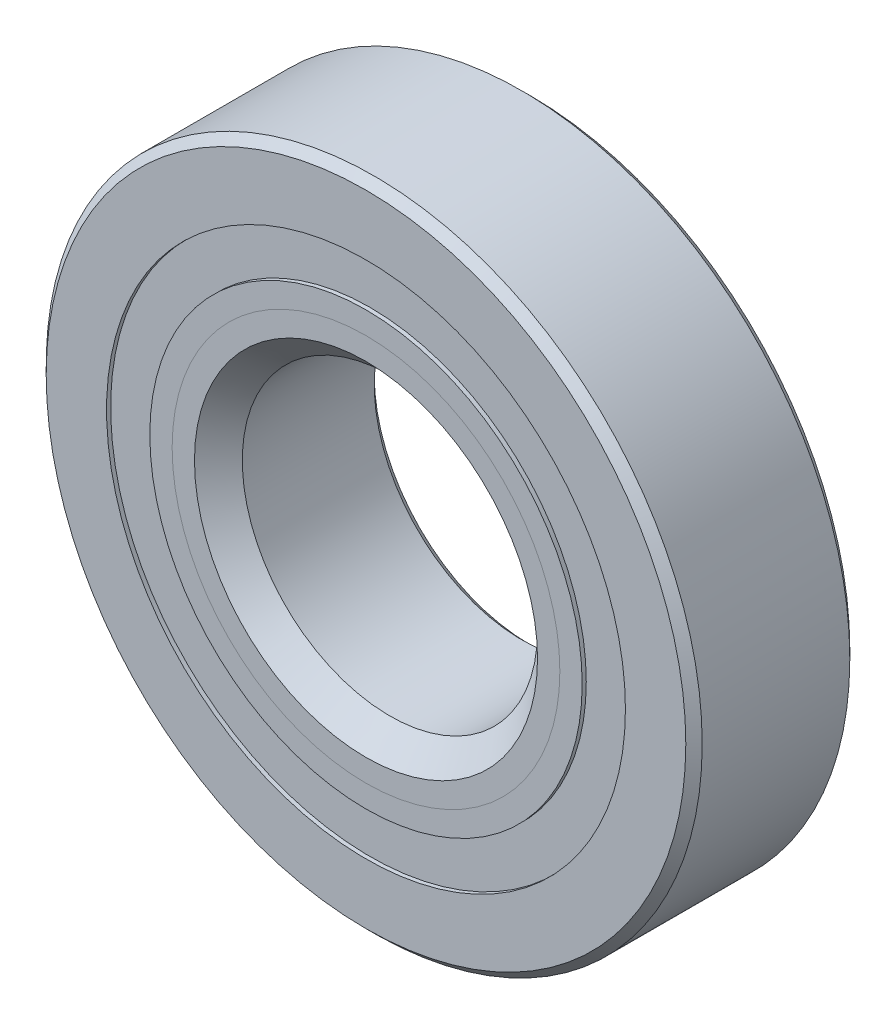
ISO-10303-21;
HEADER;
FILE_DESCRIPTION(('STEP AP214'),'2;1');
FILE_NAME('part.step','',(''),(''),'','','');
FILE_SCHEMA(('AUTOMOTIVE_DESIGN { 1 0 10303 214 1 1 1 1 }'));
ENDSEC;
DATA;
#1=APPLICATION_CONTEXT('core data for automotive mechanical design processes');
#2=APPLICATION_PROTOCOL_DEFINITION('international standard','automotive_design',2000,#1);
#3=PRODUCT_CONTEXT('',#1,'mechanical');
#4=PRODUCT('Part','Part','',(#3));
#5=PRODUCT_RELATED_PRODUCT_CATEGORY('part','',(#4));
#6=PRODUCT_DEFINITION_FORMATION('','',#4);
#7=PRODUCT_DEFINITION_CONTEXT('part definition',#1,'design');
#8=PRODUCT_DEFINITION('design','',#6,#7);
#9=PRODUCT_DEFINITION_SHAPE('','',#8);
#10=(LENGTH_UNIT() NAMED_UNIT(*) SI_UNIT(.MILLI.,.METRE.));
#11=(NAMED_UNIT(*) PLANE_ANGLE_UNIT() SI_UNIT($,.RADIAN.));
#12=(NAMED_UNIT(*) SI_UNIT($,.STERADIAN.) SOLID_ANGLE_UNIT());
#13=UNCERTAINTY_MEASURE_WITH_UNIT(LENGTH_MEASURE(1.E-05),#10,'distance_accuracy_value','');
#14=(GEOMETRIC_REPRESENTATION_CONTEXT(3) GLOBAL_UNCERTAINTY_ASSIGNED_CONTEXT((#13)) GLOBAL_UNIT_ASSIGNED_CONTEXT((#10,
#11,#12)) REPRESENTATION_CONTEXT('',''));
#15=CARTESIAN_POINT('',(0.,0.,0.));
#16=DIRECTION('',(0.,0.,1.));
#17=DIRECTION('',(1.,0.,0.));
#18=AXIS2_PLACEMENT_3D('',#15,#16,#17);
#19=CARTESIAN_POINT('',(0.,25.1121565934066,-7.540625));
#20=DIRECTION('',(0.,0.,1.));
#21=DIRECTION('',(1.,0.,0.));
#22=AXIS2_PLACEMENT_3D('',#19,#20,#21);
#23=PLANE('',#22);
#24=CARTESIAN_POINT('',(0.,0.,-7.540625));
#25=DIRECTION('',(0.,0.,1.));
#26=DIRECTION('',(1.,0.,0.));
#27=AXIS2_PLACEMENT_3D('',#24,#25,#26);
#28=CIRCLE('',#27,25.1121565934066);
#29=CARTESIAN_POINT('',(25.1121565934066,0.,-7.540625));
#30=VERTEX_POINT('',#29);
#31=EDGE_CURVE('E55',#30,#30,#28,.T.);
#32=ORIENTED_EDGE('',*,*,#31,.F.);
#33=EDGE_LOOP('',(#32));
#34=FACE_BOUND('',#33,.T.);
#35=CARTESIAN_POINT('',(0.,0.,-7.540625));
#36=DIRECTION('',(0.,0.,1.));
#37=DIRECTION('',(1.,0.,0.));
#38=AXIS2_PLACEMENT_3D('',#35,#36,#37);
#39=CIRCLE('',#38,20.9253434065934);
#40=CARTESIAN_POINT('',(20.9253434065934,0.,-7.540625));
#41=VERTEX_POINT('',#40);
#42=EDGE_CURVE('E11',#41,#41,#39,.T.);
#43=ORIENTED_EDGE('',*,*,#42,.T.);
#44=EDGE_LOOP('',(#43));
#45=FACE_BOUND('',#44,.T.);
#46=ADVANCED_FACE('F41',(#34,#45),#23,.F.);
#47=CARTESIAN_POINT('',(0.,0.,7.9375));
#48=DIRECTION('',(0.,0.,1.));
#49=DIRECTION('',(1.,0.,0.));
#50=AXIS2_PLACEMENT_3D('',#47,#48,#49);
#51=CYLINDRICAL_SURFACE('',#50,20.9253434065934);
#52=ORIENTED_EDGE('',*,*,#42,.F.);
#53=EDGE_LOOP('',(#52));
#54=FACE_BOUND('',#53,.T.);
#55=CARTESIAN_POINT('',(0.,0.,-4.10214178383694));
#56=DIRECTION('',(0.,0.,1.));
#57=DIRECTION('',(1.,0.,0.));
#58=AXIS2_PLACEMENT_3D('',#55,#56,#57);
#59=CIRCLE('',#58,20.9253434065934);
#60=CARTESIAN_POINT('',(20.9253434065934,0.,-4.10214178383694));
#61=VERTEX_POINT('',#60);
#62=EDGE_CURVE('E47',#61,#61,#59,.T.);
#63=ORIENTED_EDGE('',*,*,#62,.T.);
#64=EDGE_LOOP('',(#63));
#65=FACE_BOUND('',#64,.T.);
#66=ADVANCED_FACE('F64',(#54,#65),#51,.F.);
#67=CARTESIAN_POINT('',(0.,25.1121565934066,-4.10214178383694));
#68=DIRECTION('',(0.,0.,-1.));
#69=DIRECTION('',(-1.,0.,0.));
#70=AXIS2_PLACEMENT_3D('',#67,#68,#69);
#71=PLANE('',#70);
#72=ORIENTED_EDGE('',*,*,#62,.F.);
#73=EDGE_LOOP('',(#72));
#74=FACE_BOUND('',#73,.T.);
#75=CARTESIAN_POINT('',(0.,0.,-4.10214178383694));
#76=DIRECTION('',(0.,0.,1.));
#77=DIRECTION('',(1.,0.,0.));
#78=AXIS2_PLACEMENT_3D('',#75,#76,#77);
#79=CIRCLE('',#78,25.1121565934066);
#80=CARTESIAN_POINT('',(25.1121565934066,0.,-4.10214178383694));
#81=VERTEX_POINT('',#80);
#82=EDGE_CURVE('E51',#81,#81,#79,.T.);
#83=ORIENTED_EDGE('',*,*,#82,.T.);
#84=EDGE_LOOP('',(#83));
#85=FACE_BOUND('',#84,.T.);
#86=ADVANCED_FACE('F68',(#74,#85),#71,.F.);
#87=CARTESIAN_POINT('',(0.,0.,7.9375));
#88=DIRECTION('',(0.,0.,1.));
#89=DIRECTION('',(1.,0.,0.));
#90=AXIS2_PLACEMENT_3D('',#87,#88,#89);
#91=CYLINDRICAL_SURFACE('',#90,25.1121565934066);
#92=ORIENTED_EDGE('',*,*,#82,.F.);
#93=EDGE_LOOP('',(#92));
#94=FACE_BOUND('',#93,.T.);
#95=ORIENTED_EDGE('',*,*,#31,.T.);
#96=EDGE_LOOP('',(#95));
#97=FACE_BOUND('',#96,.T.);
#98=ADVANCED_FACE('F61',(#94,#97),#91,.T.);
#99=CLOSED_SHELL('',(#46,#66,#86,#98));
#100=MANIFOLD_SOLID_BREP('B2',#99);
#101=CARTESIAN_POINT('',(0.,25.1121565934066,7.54062500000001));
#102=DIRECTION('',(0.,0.,-1.));
#103=DIRECTION('',(-1.,0.,0.));
#104=AXIS2_PLACEMENT_3D('',#101,#102,#103);
#105=PLANE('',#104);
#106=CARTESIAN_POINT('',(0.,0.,7.540625));
#107=DIRECTION('',(0.,0.,1.));
#108=DIRECTION('',(1.,0.,0.));
#109=AXIS2_PLACEMENT_3D('',#106,#107,#108);
#110=CIRCLE('',#109,20.9253434065934);
#111=CARTESIAN_POINT('',(20.9253434065934,0.,7.540625));
#112=VERTEX_POINT('',#111);
#113=EDGE_CURVE('E40',#112,#112,#110,.T.);
#114=ORIENTED_EDGE('',*,*,#113,.F.);
#115=EDGE_LOOP('',(#114));
#116=FACE_BOUND('',#115,.T.);
#117=CARTESIAN_POINT('',(0.,0.,7.54062500000001));
#118=DIRECTION('',(0.,0.,1.));
#119=DIRECTION('',(1.,0.,0.));
#120=AXIS2_PLACEMENT_3D('',#117,#118,#119);
#121=CIRCLE('',#120,25.1121565934066);
#122=CARTESIAN_POINT('',(25.1121565934066,0.,7.54062500000001));
#123=VERTEX_POINT('',#122);
#124=EDGE_CURVE('E122',#123,#123,#121,.T.);
#125=ORIENTED_EDGE('',*,*,#124,.T.);
#126=EDGE_LOOP('',(#125));
#127=FACE_BOUND('',#126,.T.);
#128=ADVANCED_FACE('F108',(#116,#127),#105,.F.);
#129=CARTESIAN_POINT('',(0.,0.,7.9375));
#130=DIRECTION('',(0.,0.,1.));
#131=DIRECTION('',(1.,0.,0.));
#132=AXIS2_PLACEMENT_3D('',#129,#130,#131);
#133=CYLINDRICAL_SURFACE('',#132,20.9253434065934);
#134=CARTESIAN_POINT('',(0.,0.,4.10214178383694));
#135=DIRECTION('',(0.,0.,1.));
#136=DIRECTION('',(1.,0.,0.));
#137=AXIS2_PLACEMENT_3D('',#134,#135,#136);
#138=CIRCLE('',#137,20.9253434065934);
#139=CARTESIAN_POINT('',(20.9253434065934,0.,4.10214178383694));
#140=VERTEX_POINT('',#139);
#141=EDGE_CURVE('E114',#140,#140,#138,.T.);
#142=ORIENTED_EDGE('',*,*,#141,.F.);
#143=EDGE_LOOP('',(#142));
#144=FACE_BOUND('',#143,.T.);
#145=ORIENTED_EDGE('',*,*,#113,.T.);
#146=EDGE_LOOP('',(#145));
#147=FACE_BOUND('',#146,.T.);
#148=ADVANCED_FACE('F137',(#144,#147),#133,.F.);
#149=CARTESIAN_POINT('',(0.,25.1121565934066,4.10214178383694));
#150=DIRECTION('',(0.,0.,1.));
#151=DIRECTION('',(1.,0.,0.));
#152=AXIS2_PLACEMENT_3D('',#149,#150,#151);
#153=PLANE('',#152);
#154=CARTESIAN_POINT('',(0.,0.,4.10214178383694));
#155=DIRECTION('',(0.,0.,1.));
#156=DIRECTION('',(1.,0.,0.));
#157=AXIS2_PLACEMENT_3D('',#154,#155,#156);
#158=CIRCLE('',#157,25.1121565934066);
#159=CARTESIAN_POINT('',(25.1121565934066,0.,4.10214178383694));
#160=VERTEX_POINT('',#159);
#161=EDGE_CURVE('E118',#160,#160,#158,.T.);
#162=ORIENTED_EDGE('',*,*,#161,.F.);
#163=EDGE_LOOP('',(#162));
#164=FACE_BOUND('',#163,.T.);
#165=ORIENTED_EDGE('',*,*,#141,.T.);
#166=EDGE_LOOP('',(#165));
#167=FACE_BOUND('',#166,.T.);
#168=ADVANCED_FACE('F132',(#164,#167),#153,.F.);
#169=CARTESIAN_POINT('',(0.,0.,7.9375));
#170=DIRECTION('',(0.,0.,1.));
#171=DIRECTION('',(1.,0.,0.));
#172=AXIS2_PLACEMENT_3D('',#169,#170,#171);
#173=CYLINDRICAL_SURFACE('',#172,25.1121565934066);
#174=ORIENTED_EDGE('',*,*,#124,.F.);
#175=EDGE_LOOP('',(#174));
#176=FACE_BOUND('',#175,.T.);
#177=ORIENTED_EDGE('',*,*,#161,.T.);
#178=EDGE_LOOP('',(#177));
#179=FACE_BOUND('',#178,.T.);
#180=ADVANCED_FACE('F129',(#176,#179),#173,.T.);
#181=CLOSED_SHELL('',(#128,#148,#168,#180));
#182=MANIFOLD_SOLID_BREP('B6',#181);
#183=CARTESIAN_POINT('',(-11.5093749999997,19.9348222633632,0.));
#184=DIRECTION('',(0.,0.,1.));
#185=DIRECTION('',(-0.499999999999989,0.866025403784445,0.));
#186=AXIS2_PLACEMENT_3D('',#183,#184,#185);
#187=SPHERICAL_SURFACE('',#186,4.10214178383694);
#188=CARTESIAN_POINT('',(-11.5093749999997,19.9348222633632,4.10214178383694));
#189=VERTEX_POINT('',#188);
#190=VERTEX_LOOP('',#189);
#191=FACE_BOUND('',#190,.T.);
#192=ADVANCED_FACE('F175',(#191),#187,.T.);
#193=CLOSED_SHELL('',(#192));
#194=MANIFOLD_SOLID_BREP('B35',#193);
#195=CARTESIAN_POINT('',(-19.9348222633629,11.5093750000002,0.));
#196=DIRECTION('',(0.,0.,1.));
#197=DIRECTION('',(-0.866025403784433,0.50000000000001,0.));
#198=AXIS2_PLACEMENT_3D('',#195,#196,#197);
#199=SPHERICAL_SURFACE('',#198,4.10214178383694);
#200=CARTESIAN_POINT('',(-19.9348222633629,11.5093750000002,4.10214178383694));
#201=VERTEX_POINT('',#200);
#202=VERTEX_LOOP('',#201);
#203=FACE_BOUND('',#202,.T.);
#204=ADVANCED_FACE('F206',(#203),#199,.T.);
#205=CLOSED_SHELL('',(#204));
#206=MANIFOLD_SOLID_BREP('B104',#205);
#207=CARTESIAN_POINT('',(-23.01875,2.41108608205486E-13,0.));
#208=DIRECTION('',(0.,0.,1.));
#209=DIRECTION('',(-1.,0.,0.));
#210=AXIS2_PLACEMENT_3D('',#207,#208,#209);
#211=SPHERICAL_SURFACE('',#210,4.10214178383694);
#212=CARTESIAN_POINT('',(-23.01875,2.41108608205486E-13,4.10214178383694));
#213=VERTEX_POINT('',#212);
#214=VERTEX_LOOP('',#213);
#215=FACE_BOUND('',#214,.T.);
#216=ADVANCED_FACE('F237',(#215),#211,.T.);
#217=CLOSED_SHELL('',(#216));
#218=MANIFOLD_SOLID_BREP('B171',#217);
#219=CARTESIAN_POINT('',(-19.9348222633632,-11.5093749999998,0.));
#220=DIRECTION('',(0.,0.,1.));
#221=DIRECTION('',(-0.866025403784443,-0.499999999999992,0.));
#222=AXIS2_PLACEMENT_3D('',#219,#220,#221);
#223=SPHERICAL_SURFACE('',#222,4.10214178383694);
#224=CARTESIAN_POINT('',(-19.9348222633632,-11.5093749999998,4.10214178383694));
#225=VERTEX_POINT('',#224);
#226=VERTEX_LOOP('',#225);
#227=FACE_BOUND('',#226,.T.);
#228=ADVANCED_FACE('F268',(#227),#223,.T.);
#229=CLOSED_SHELL('',(#228));
#230=MANIFOLD_SOLID_BREP('B202',#229);
#231=CARTESIAN_POINT('',(-11.5093750000002,-19.9348222633629,0.));
#232=DIRECTION('',(0.,0.,1.));
#233=DIRECTION('',(-0.500000000000007,-0.866025403784435,0.));
#234=AXIS2_PLACEMENT_3D('',#231,#232,#233);
#235=SPHERICAL_SURFACE('',#234,4.10214178383694);
#236=CARTESIAN_POINT('',(-11.5093750000002,-19.9348222633629,4.10214178383694));
#237=VERTEX_POINT('',#236);
#238=VERTEX_LOOP('',#237);
#239=FACE_BOUND('',#238,.T.);
#240=ADVANCED_FACE('F299',(#239),#235,.T.);
#241=CLOSED_SHELL('',(#240));
#242=MANIFOLD_SOLID_BREP('B233',#241);
#243=CARTESIAN_POINT('',(-1.60739072136991E-13,-23.01875,0.));
#244=DIRECTION('',(0.,0.,1.));
#245=DIRECTION('',(0.,-1.,0.));
#246=AXIS2_PLACEMENT_3D('',#243,#244,#245);
#247=SPHERICAL_SURFACE('',#246,4.10214178383694);
#248=CARTESIAN_POINT('',(-1.60739072136991E-13,-23.01875,4.10214178383694));
#249=VERTEX_POINT('',#248);
#250=VERTEX_LOOP('',#249);
#251=FACE_BOUND('',#250,.T.);
#252=ADVANCED_FACE('F330',(#251),#247,.T.);
#253=CLOSED_SHELL('',(#252));
#254=MANIFOLD_SOLID_BREP('B264',#253);
#255=CARTESIAN_POINT('',(11.5093749999999,-19.9348222633631,0.));
#256=DIRECTION('',(0.,0.,1.));
#257=DIRECTION('',(0.499999999999995,-0.866025403784442,0.));
#258=AXIS2_PLACEMENT_3D('',#255,#256,#257);
#259=SPHERICAL_SURFACE('',#258,4.10214178383694);
#260=CARTESIAN_POINT('',(11.5093749999999,-19.9348222633631,4.10214178383694));
#261=VERTEX_POINT('',#260);
#262=VERTEX_LOOP('',#261);
#263=FACE_BOUND('',#262,.T.);
#264=ADVANCED_FACE('F361',(#263),#259,.T.);
#265=CLOSED_SHELL('',(#264));
#266=MANIFOLD_SOLID_BREP('B295',#265);
#267=CARTESIAN_POINT('',(19.934822263363,-11.5093750000001,0.));
#268=DIRECTION('',(0.,0.,1.));
#269=DIRECTION('',(0.866025403784436,-0.500000000000004,0.));
#270=AXIS2_PLACEMENT_3D('',#267,#268,#269);
#271=SPHERICAL_SURFACE('',#270,4.10214178383694);
#272=CARTESIAN_POINT('',(19.934822263363,-11.5093750000001,4.10214178383694));
#273=VERTEX_POINT('',#272);
#274=VERTEX_LOOP('',#273);
#275=FACE_BOUND('',#274,.T.);
#276=ADVANCED_FACE('F392',(#275),#271,.T.);
#277=CLOSED_SHELL('',(#276));
#278=MANIFOLD_SOLID_BREP('B326',#277);
#279=CARTESIAN_POINT('',(23.01875,0.,0.));
#280=DIRECTION('',(0.,0.,1.));
#281=DIRECTION('',(1.,0.,0.));
#282=AXIS2_PLACEMENT_3D('',#279,#280,#281);
#283=SPHERICAL_SURFACE('',#282,4.10214178383694);
#284=CARTESIAN_POINT('',(23.01875,0.,4.10214178383694));
#285=VERTEX_POINT('',#284);
#286=VERTEX_LOOP('',#285);
#287=FACE_BOUND('',#286,.T.);
#288=ADVANCED_FACE('F423',(#287),#283,.T.);
#289=CLOSED_SHELL('',(#288));
#290=MANIFOLD_SOLID_BREP('B357',#289);
#291=CARTESIAN_POINT('',(19.9348222633631,11.509375,0.));
#292=DIRECTION('',(0.,0.,1.));
#293=DIRECTION('',(0.86602540378444,0.499999999999998,0.));
#294=AXIS2_PLACEMENT_3D('',#291,#292,#293);
#295=SPHERICAL_SURFACE('',#294,4.10214178383694);
#296=CARTESIAN_POINT('',(19.9348222633631,11.509375,4.10214178383694));
#297=VERTEX_POINT('',#296);
#298=VERTEX_LOOP('',#297);
#299=FACE_BOUND('',#298,.T.);
#300=ADVANCED_FACE('F454',(#299),#295,.T.);
#301=CLOSED_SHELL('',(#300));
#302=MANIFOLD_SOLID_BREP('B388',#301);
#303=CARTESIAN_POINT('',(11.509375,19.934822263363,0.));
#304=DIRECTION('',(0.,0.,1.));
#305=DIRECTION('',(0.500000000000001,0.866025403784438,0.));
#306=AXIS2_PLACEMENT_3D('',#303,#304,#305);
#307=SPHERICAL_SURFACE('',#306,4.10214178383694);
#308=CARTESIAN_POINT('',(11.509375,19.934822263363,4.10214178383694));
#309=VERTEX_POINT('',#308);
#310=VERTEX_LOOP('',#309);
#311=FACE_BOUND('',#310,.T.);
#312=ADVANCED_FACE('F485',(#311),#307,.T.);
#313=CLOSED_SHELL('',(#312));
#314=MANIFOLD_SOLID_BREP('B419',#313);
#315=CARTESIAN_POINT('',(0.,23.01875,0.));
#316=DIRECTION('',(0.,0.,1.));
#317=DIRECTION('',(0.,1.,0.));
#318=AXIS2_PLACEMENT_3D('',#315,#316,#317);
#319=SPHERICAL_SURFACE('',#318,4.10214178383694);
#320=CARTESIAN_POINT('',(0.,23.01875,4.10214178383694));
#321=VERTEX_POINT('',#320);
#322=VERTEX_LOOP('',#321);
#323=FACE_BOUND('',#322,.T.);
#324=ADVANCED_FACE('F518',(#323),#319,.T.);
#325=CLOSED_SHELL('',(#324));
#326=MANIFOLD_SOLID_BREP('B450',#325);
#327=CARTESIAN_POINT('',(0.,18.7636987573375,7.9375));
#328=DIRECTION('',(0.,0.,-1.));
#329=DIRECTION('',(-1.,0.,0.));
#330=AXIS2_PLACEMENT_3D('',#327,#328,#329);
#331=PLANE('',#330);
#332=CARTESIAN_POINT('',(0.,0.,7.9375));
#333=DIRECTION('',(0.,0.,1.));
#334=DIRECTION('',(1.,0.,0.));
#335=AXIS2_PLACEMENT_3D('',#332,#333,#334);
#336=CIRCLE('',#335,16.6020541080815);
#337=CARTESIAN_POINT('',(16.6020541080815,0.,7.9375));
#338=VERTEX_POINT('',#337);
#339=EDGE_CURVE('E572',#338,#338,#336,.T.);
#340=ORIENTED_EDGE('',*,*,#339,.F.);
#341=EDGE_LOOP('',(#340));
#342=FACE_BOUND('',#341,.T.);
#343=CARTESIAN_POINT('',(0.,0.,7.9375));
#344=DIRECTION('',(0.,0.,1.));
#345=DIRECTION('',(1.,0.,0.));
#346=AXIS2_PLACEMENT_3D('',#343,#344,#345);
#347=CIRCLE('',#346,18.7636987573375);
#348=CARTESIAN_POINT('',(18.7636987573375,0.,7.9375));
#349=VERTEX_POINT('',#348);
#350=EDGE_CURVE('E517',#349,#349,#347,.T.);
#351=ORIENTED_EDGE('',*,*,#350,.T.);
#352=EDGE_LOOP('',(#351));
#353=FACE_BOUND('',#352,.T.);
#354=ADVANCED_FACE('F538',(#342,#353),#331,.F.);
#355=CARTESIAN_POINT('',(0.,0.,5.77585535074407));
#356=DIRECTION('',(0.,0.,1.));
#357=DIRECTION('',(1.,0.,0.));
#358=AXIS2_PLACEMENT_3D('',#355,#356,#357);
#359=CONICAL_SURFACE('',#358,16.6020541080815,0.78539816339745);
#360=ORIENTED_EDGE('',*,*,#350,.F.);
#361=EDGE_LOOP('',(#360));
#362=FACE_BOUND('',#361,.T.);
#363=CARTESIAN_POINT('',(0.,0.,5.77585535074407));
#364=DIRECTION('',(0.,0.,1.));
#365=DIRECTION('',(1.,0.,0.));
#366=AXIS2_PLACEMENT_3D('',#363,#364,#365);
#367=CIRCLE('',#366,16.6020541080815);
#368=CARTESIAN_POINT('',(16.6020541080815,0.,5.77585535074407));
#369=VERTEX_POINT('',#368);
#370=EDGE_CURVE('E544',#369,#369,#367,.T.);
#371=ORIENTED_EDGE('',*,*,#370,.T.);
#372=EDGE_LOOP('',(#371));
#373=FACE_BOUND('',#372,.T.);
#374=ADVANCED_FACE('F579',(#362,#373),#359,.T.);
#375=CARTESIAN_POINT('',(0.,0.,7.9375));
#376=DIRECTION('',(0.,0.,1.));
#377=DIRECTION('',(1.,0.,0.));
#378=AXIS2_PLACEMENT_3D('',#375,#376,#377);
#379=CYLINDRICAL_SURFACE('',#378,16.6020541080815);
#380=ORIENTED_EDGE('',*,*,#370,.F.);
#381=EDGE_LOOP('',(#380));
#382=FACE_BOUND('',#381,.T.);
#383=CARTESIAN_POINT('',(0.,0.,0.));
#384=DIRECTION('',(0.,0.,1.));
#385=DIRECTION('',(1.,0.,0.));
#386=AXIS2_PLACEMENT_3D('',#383,#384,#385);
#387=CIRCLE('',#386,16.6020541080815);
#388=CARTESIAN_POINT('',(16.6020541080815,0.,0.));
#389=VERTEX_POINT('',#388);
#390=EDGE_CURVE('E548',#389,#389,#387,.T.);
#391=ORIENTED_EDGE('',*,*,#390,.T.);
#392=EDGE_LOOP('',(#391));
#393=FACE_BOUND('',#392,.T.);
#394=ADVANCED_FACE('F583',(#382,#393),#379,.T.);
#395=CARTESIAN_POINT('',(0.,16.6020541080815,0.));
#396=DIRECTION('',(0.,0.,-1.));
#397=DIRECTION('',(-1.,0.,0.));
#398=AXIS2_PLACEMENT_3D('',#395,#396,#397);
#399=PLANE('',#398);
#400=ORIENTED_EDGE('',*,*,#390,.F.);
#401=EDGE_LOOP('',(#400));
#402=FACE_BOUND('',#401,.T.);
#403=CARTESIAN_POINT('',(0.,0.,0.));
#404=DIRECTION('',(0.,0.,1.));
#405=DIRECTION('',(1.,0.,0.));
#406=AXIS2_PLACEMENT_3D('',#403,#404,#405);
#407=CIRCLE('',#406,18.9166082161631);
#408=CARTESIAN_POINT('',(18.9166082161631,0.,0.));
#409=VERTEX_POINT('',#408);
#410=EDGE_CURVE('E552',#409,#409,#407,.T.);
#411=ORIENTED_EDGE('',*,*,#410,.T.);
#412=EDGE_LOOP('',(#411));
#413=FACE_BOUND('',#412,.T.);
#414=ADVANCED_FACE('F588',(#402,#413),#399,.F.);
#415=CARTESIAN_POINT('',(0.,0.,0.));
#416=DIRECTION('',(0.,0.,1.));
#417=DIRECTION('',(1.,0.,0.));
#418=AXIS2_PLACEMENT_3D('',#415,#416,#417);
#419=TOROIDAL_SURFACE('',#418,23.01875,4.10214178383694);
#420=ORIENTED_EDGE('',*,*,#410,.F.);
#421=EDGE_LOOP('',(#420));
#422=FACE_BOUND('',#421,.T.);
#423=CARTESIAN_POINT('',(0.,0.,-3.52777777777778));
#424=DIRECTION('',(0.,0.,1.));
#425=DIRECTION('',(1.,0.,0.));
#426=AXIS2_PLACEMENT_3D('',#423,#424,#425);
#427=CIRCLE('',#426,20.9253434065934);
#428=CARTESIAN_POINT('',(20.9253434065934,0.,-3.52777777777778));
#429=VERTEX_POINT('',#428);
#430=EDGE_CURVE('E557',#429,#429,#427,.T.);
#431=ORIENTED_EDGE('',*,*,#430,.T.);
#432=EDGE_LOOP('',(#431));
#433=FACE_BOUND('',#432,.T.);
#434=ADVANCED_FACE('F594',(#422,#433),#419,.F.);
#435=CARTESIAN_POINT('',(0.,0.,7.9375));
#436=DIRECTION('',(0.,0.,1.));
#437=DIRECTION('',(1.,0.,0.));
#438=AXIS2_PLACEMENT_3D('',#435,#436,#437);
#439=CYLINDRICAL_SURFACE('',#438,20.9253434065934);
#440=ORIENTED_EDGE('',*,*,#430,.F.);
#441=EDGE_LOOP('',(#440));
#442=FACE_BOUND('',#441,.T.);
#443=CARTESIAN_POINT('',(0.,0.,-7.9375));
#444=DIRECTION('',(0.,0.,1.));
#445=DIRECTION('',(1.,0.,0.));
#446=AXIS2_PLACEMENT_3D('',#443,#444,#445);
#447=CIRCLE('',#446,20.9253434065934);
#448=CARTESIAN_POINT('',(20.9253434065934,0.,-7.9375));
#449=VERTEX_POINT('',#448);
#450=EDGE_CURVE('E560',#449,#449,#447,.T.);
#451=ORIENTED_EDGE('',*,*,#450,.T.);
#452=EDGE_LOOP('',(#451));
#453=FACE_BOUND('',#452,.T.);
#454=ADVANCED_FACE('F598',(#442,#453),#439,.T.);
#455=CARTESIAN_POINT('',(0.,15.08125,-7.9375));
#456=DIRECTION('',(0.,0.,1.));
#457=DIRECTION('',(1.,0.,0.));
#458=AXIS2_PLACEMENT_3D('',#455,#456,#457);
#459=PLANE('',#458);
#460=ORIENTED_EDGE('',*,*,#450,.F.);
#461=EDGE_LOOP('',(#460));
#462=FACE_BOUND('',#461,.T.);
#463=CARTESIAN_POINT('',(0.,0.,-7.9375));
#464=DIRECTION('',(0.,0.,1.));
#465=DIRECTION('',(1.,0.,0.));
#466=AXIS2_PLACEMENT_3D('',#463,#464,#465);
#467=CIRCLE('',#466,15.08125);
#468=CARTESIAN_POINT('',(15.08125,0.,-7.9375));
#469=VERTEX_POINT('',#468);
#470=EDGE_CURVE('E563',#469,#469,#467,.T.);
#471=ORIENTED_EDGE('',*,*,#470,.T.);
#472=EDGE_LOOP('',(#471));
#473=FACE_BOUND('',#472,.T.);
#474=ADVANCED_FACE('F602',(#462,#473),#459,.F.);
#475=CARTESIAN_POINT('',(0.,0.,-7.14375));
#476=DIRECTION('',(0.,0.,-1.));
#477=DIRECTION('',(-1.,0.,0.));
#478=AXIS2_PLACEMENT_3D('',#475,#476,#477);
#479=CONICAL_SURFACE('',#478,14.2875,0.785398163397447);
#480=ORIENTED_EDGE('',*,*,#470,.F.);
#481=EDGE_LOOP('',(#480));
#482=FACE_BOUND('',#481,.T.);
#483=CARTESIAN_POINT('',(0.,0.,-7.14375));
#484=DIRECTION('',(0.,0.,1.));
#485=DIRECTION('',(1.,0.,0.));
#486=AXIS2_PLACEMENT_3D('',#483,#484,#485);
#487=CIRCLE('',#486,14.2875);
#488=CARTESIAN_POINT('',(14.2875,0.,-7.14375));
#489=VERTEX_POINT('',#488);
#490=EDGE_CURVE('E566',#489,#489,#487,.T.);
#491=ORIENTED_EDGE('',*,*,#490,.T.);
#492=EDGE_LOOP('',(#491));
#493=FACE_BOUND('',#492,.T.);
#494=ADVANCED_FACE('F606',(#482,#493),#479,.F.);
#495=CARTESIAN_POINT('',(0.,0.,7.9375));
#496=DIRECTION('',(0.,0.,1.));
#497=DIRECTION('',(1.,0.,0.));
#498=AXIS2_PLACEMENT_3D('',#495,#496,#497);
#499=CYLINDRICAL_SURFACE('',#498,14.2875);
#500=ORIENTED_EDGE('',*,*,#490,.F.);
#501=EDGE_LOOP('',(#500));
#502=FACE_BOUND('',#501,.T.);
#503=CARTESIAN_POINT('',(0.,0.,5.62294589191848));
#504=DIRECTION('',(0.,0.,1.));
#505=DIRECTION('',(1.,0.,0.));
#506=AXIS2_PLACEMENT_3D('',#503,#504,#505);
#507=CIRCLE('',#506,14.2875);
#508=CARTESIAN_POINT('',(14.2875,0.,5.62294589191848));
#509=VERTEX_POINT('',#508);
#510=EDGE_CURVE('E569',#509,#509,#507,.T.);
#511=ORIENTED_EDGE('',*,*,#510,.T.);
#512=EDGE_LOOP('',(#511));
#513=FACE_BOUND('',#512,.T.);
#514=ADVANCED_FACE('F610',(#502,#513),#499,.F.);
#515=CARTESIAN_POINT('',(0.,0.,7.9375));
#516=DIRECTION('',(0.,0.,1.));
#517=DIRECTION('',(1.,0.,0.));
#518=AXIS2_PLACEMENT_3D('',#515,#516,#517);
#519=CONICAL_SURFACE('',#518,16.6020541080815,0.78539816339745);
#520=ORIENTED_EDGE('',*,*,#510,.F.);
#521=EDGE_LOOP('',(#520));
#522=FACE_BOUND('',#521,.T.);
#523=ORIENTED_EDGE('',*,*,#339,.T.);
#524=EDGE_LOOP('',(#523));
#525=FACE_BOUND('',#524,.T.);
#526=ADVANCED_FACE('F576',(#522,#525),#519,.F.);
#527=CLOSED_SHELL('',(#354,#374,#394,#414,#434,#454,#474,#494,#514,#526));
#528=MANIFOLD_SOLID_BREP('B481',#527);
#529=CARTESIAN_POINT('',(0.,20.9253434065934,7.9375));
#530=DIRECTION('',(0.,0.,-1.));
#531=DIRECTION('',(-1.,0.,0.));
#532=AXIS2_PLACEMENT_3D('',#529,#530,#531);
#533=PLANE('',#532);
#534=CARTESIAN_POINT('',(0.,0.,7.9375));
#535=DIRECTION('',(0.,0.,1.));
#536=DIRECTION('',(1.,0.,0.));
#537=AXIS2_PLACEMENT_3D('',#534,#535,#536);
#538=CIRCLE('',#537,18.7636987573375);
#539=CARTESIAN_POINT('',(18.7636987573375,0.,7.9375));
#540=VERTEX_POINT('',#539);
#541=EDGE_CURVE('E537',#540,#540,#538,.T.);
#542=ORIENTED_EDGE('',*,*,#541,.F.);
#543=EDGE_LOOP('',(#542));
#544=FACE_BOUND('',#543,.T.);
#545=CARTESIAN_POINT('',(0.,0.,7.9375));
#546=DIRECTION('',(0.,0.,1.));
#547=DIRECTION('',(1.,0.,0.));
#548=AXIS2_PLACEMENT_3D('',#545,#546,#547);
#549=CIRCLE('',#548,20.9253434065934);
#550=CARTESIAN_POINT('',(20.9253434065934,0.,7.9375));
#551=VERTEX_POINT('',#550);
#552=EDGE_CURVE('E718',#551,#551,#549,.T.);
#553=ORIENTED_EDGE('',*,*,#552,.T.);
#554=EDGE_LOOP('',(#553));
#555=FACE_BOUND('',#554,.T.);
#556=ADVANCED_FACE('F696',(#544,#555),#533,.F.);
#557=CARTESIAN_POINT('',(0.,0.,7.9375));
#558=DIRECTION('',(0.,0.,1.));
#559=DIRECTION('',(1.,0.,0.));
#560=AXIS2_PLACEMENT_3D('',#557,#558,#559);
#561=CONICAL_SURFACE('',#560,18.7636987573375,0.78539816339745);
#562=CARTESIAN_POINT('',(0.,0.,5.77585535074407));
#563=DIRECTION('',(0.,0.,1.));
#564=DIRECTION('',(1.,0.,0.));
#565=AXIS2_PLACEMENT_3D('',#562,#563,#564);
#566=CIRCLE('',#565,16.6020541080815);
#567=CARTESIAN_POINT('',(16.6020541080815,0.,5.77585535074407));
#568=VERTEX_POINT('',#567);
#569=EDGE_CURVE('E702',#568,#568,#566,.T.);
#570=ORIENTED_EDGE('',*,*,#569,.F.);
#571=EDGE_LOOP('',(#570));
#572=FACE_BOUND('',#571,.T.);
#573=ORIENTED_EDGE('',*,*,#541,.T.);
#574=EDGE_LOOP('',(#573));
#575=FACE_BOUND('',#574,.T.);
#576=ADVANCED_FACE('F743',(#572,#575),#561,.F.);
#577=CARTESIAN_POINT('',(0.,0.,7.9375));
#578=DIRECTION('',(0.,0.,1.));
#579=DIRECTION('',(1.,0.,0.));
#580=AXIS2_PLACEMENT_3D('',#577,#578,#579);
#581=CYLINDRICAL_SURFACE('',#580,16.6020541080815);
#582=CARTESIAN_POINT('',(0.,0.,0.));
#583=DIRECTION('',(0.,0.,1.));
#584=DIRECTION('',(1.,0.,0.));
#585=AXIS2_PLACEMENT_3D('',#582,#583,#584);
#586=CIRCLE('',#585,16.6020541080815);
#587=CARTESIAN_POINT('',(16.6020541080815,0.,0.));
#588=VERTEX_POINT('',#587);
#589=EDGE_CURVE('E706',#588,#588,#586,.T.);
#590=ORIENTED_EDGE('',*,*,#589,.F.);
#591=EDGE_LOOP('',(#590));
#592=FACE_BOUND('',#591,.T.);
#593=ORIENTED_EDGE('',*,*,#569,.T.);
#594=EDGE_LOOP('',(#593));
#595=FACE_BOUND('',#594,.T.);
#596=ADVANCED_FACE('F738',(#592,#595),#581,.F.);
#597=CARTESIAN_POINT('',(0.,16.6020541080815,0.));
#598=DIRECTION('',(0.,0.,1.));
#599=DIRECTION('',(1.,0.,0.));
#600=AXIS2_PLACEMENT_3D('',#597,#598,#599);
#601=PLANE('',#600);
#602=CARTESIAN_POINT('',(0.,0.,0.));
#603=DIRECTION('',(0.,0.,1.));
#604=DIRECTION('',(1.,0.,0.));
#605=AXIS2_PLACEMENT_3D('',#602,#603,#604);
#606=CIRCLE('',#605,18.9166082161631);
#607=CARTESIAN_POINT('',(18.9166082161631,0.,0.));
#608=VERTEX_POINT('',#607);
#609=EDGE_CURVE('E710',#608,#608,#606,.T.);
#610=ORIENTED_EDGE('',*,*,#609,.F.);
#611=EDGE_LOOP('',(#610));
#612=FACE_BOUND('',#611,.T.);
#613=ORIENTED_EDGE('',*,*,#589,.T.);
#614=EDGE_LOOP('',(#613));
#615=FACE_BOUND('',#614,.T.);
#616=ADVANCED_FACE('F732',(#612,#615),#601,.F.);
#617=CARTESIAN_POINT('',(0.,0.,0.));
#618=DIRECTION('',(0.,0.,1.));
#619=DIRECTION('',(1.,0.,0.));
#620=AXIS2_PLACEMENT_3D('',#617,#618,#619);
#621=TOROIDAL_SURFACE('',#620,23.01875,4.10214178383694);
#622=CARTESIAN_POINT('',(0.,0.,3.52777777777778));
#623=DIRECTION('',(0.,0.,1.));
#624=DIRECTION('',(1.,0.,0.));
#625=AXIS2_PLACEMENT_3D('',#622,#623,#624);
#626=CIRCLE('',#625,20.9253434065934);
#627=CARTESIAN_POINT('',(20.9253434065934,0.,3.52777777777778));
#628=VERTEX_POINT('',#627);
#629=EDGE_CURVE('E715',#628,#628,#626,.T.);
#630=ORIENTED_EDGE('',*,*,#629,.F.);
#631=EDGE_LOOP('',(#630));
#632=FACE_BOUND('',#631,.T.);
#633=ORIENTED_EDGE('',*,*,#609,.T.);
#634=EDGE_LOOP('',(#633));
#635=FACE_BOUND('',#634,.T.);
#636=ADVANCED_FACE('F726',(#632,#635),#621,.F.);
#637=CARTESIAN_POINT('',(0.,0.,7.9375));
#638=DIRECTION('',(0.,0.,1.));
#639=DIRECTION('',(1.,0.,0.));
#640=AXIS2_PLACEMENT_3D('',#637,#638,#639);
#641=CYLINDRICAL_SURFACE('',#640,20.9253434065934);
#642=ORIENTED_EDGE('',*,*,#552,.F.);
#643=EDGE_LOOP('',(#642));
#644=FACE_BOUND('',#643,.T.);
#645=ORIENTED_EDGE('',*,*,#629,.T.);
#646=EDGE_LOOP('',(#645));
#647=FACE_BOUND('',#646,.T.);
#648=ADVANCED_FACE('F723',(#644,#647),#641,.T.);
#649=CLOSED_SHELL('',(#556,#576,#596,#616,#636,#648));
#650=MANIFOLD_SOLID_BREP('B512',#649);
#651=CARTESIAN_POINT('',(0.,0.,7.14375));
#652=DIRECTION('',(0.,0.,-1.));
#653=DIRECTION('',(-1.,0.,0.));
#654=AXIS2_PLACEMENT_3D('',#651,#652,#653);
#655=CONICAL_SURFACE('',#654,31.75,0.785398163397448);
#656=CARTESIAN_POINT('',(0.,0.,7.9375));
#657=DIRECTION('',(0.,0.,1.));
#658=DIRECTION('',(1.,0.,0.));
#659=AXIS2_PLACEMENT_3D('',#656,#657,#658);
#660=CIRCLE('',#659,30.95625);
#661=CARTESIAN_POINT('',(30.95625,0.,7.9375));
#662=VERTEX_POINT('',#661);
#663=EDGE_CURVE('E815',#662,#662,#660,.T.);
#664=ORIENTED_EDGE('',*,*,#663,.F.);
#665=EDGE_LOOP('',(#664));
#666=FACE_BOUND('',#665,.T.);
#667=CARTESIAN_POINT('',(0.,0.,7.14375));
#668=DIRECTION('',(0.,0.,1.));
#669=DIRECTION('',(1.,0.,0.));
#670=AXIS2_PLACEMENT_3D('',#667,#668,#669);
#671=CIRCLE('',#670,31.75);
#672=CARTESIAN_POINT('',(31.75,0.,7.14375));
#673=VERTEX_POINT('',#672);
#674=EDGE_CURVE('E695',#673,#673,#671,.T.);
#675=ORIENTED_EDGE('',*,*,#674,.T.);
#676=EDGE_LOOP('',(#675));
#677=FACE_BOUND('',#676,.T.);
#678=ADVANCED_FACE('F787',(#666,#677),#655,.T.);
#679=CARTESIAN_POINT('',(0.,0.,7.9375));
#680=DIRECTION('',(0.,0.,1.));
#681=DIRECTION('',(1.,0.,0.));
#682=AXIS2_PLACEMENT_3D('',#679,#680,#681);
#683=CYLINDRICAL_SURFACE('',#682,31.75);
#684=ORIENTED_EDGE('',*,*,#674,.F.);
#685=EDGE_LOOP('',(#684));
#686=FACE_BOUND('',#685,.T.);
#687=CARTESIAN_POINT('',(0.,0.,-7.14375));
#688=DIRECTION('',(0.,0.,1.));
#689=DIRECTION('',(1.,0.,0.));
#690=AXIS2_PLACEMENT_3D('',#687,#688,#689);
#691=CIRCLE('',#690,31.75);
#692=CARTESIAN_POINT('',(31.75,0.,-7.14375));
#693=VERTEX_POINT('',#692);
#694=EDGE_CURVE('E793',#693,#693,#691,.T.);
#695=ORIENTED_EDGE('',*,*,#694,.T.);
#696=EDGE_LOOP('',(#695));
#697=FACE_BOUND('',#696,.T.);
#698=ADVANCED_FACE('F822',(#686,#697),#683,.T.);
#699=CARTESIAN_POINT('',(0.,0.,-7.9375));
#700=DIRECTION('',(0.,0.,1.));
#701=DIRECTION('',(1.,0.,0.));
#702=AXIS2_PLACEMENT_3D('',#699,#700,#701);
#703=CONICAL_SURFACE('',#702,30.95625,0.785398163397446);
#704=ORIENTED_EDGE('',*,*,#694,.F.);
#705=EDGE_LOOP('',(#704));
#706=FACE_BOUND('',#705,.T.);
#707=CARTESIAN_POINT('',(0.,0.,-7.9375));
#708=DIRECTION('',(0.,0.,1.));
#709=DIRECTION('',(1.,0.,0.));
#710=AXIS2_PLACEMENT_3D('',#707,#708,#709);
#711=CIRCLE('',#710,30.95625);
#712=CARTESIAN_POINT('',(30.95625,0.,-7.9375));
#713=VERTEX_POINT('',#712);
#714=EDGE_CURVE('E797',#713,#713,#711,.T.);
#715=ORIENTED_EDGE('',*,*,#714,.T.);
#716=EDGE_LOOP('',(#715));
#717=FACE_BOUND('',#716,.T.);
#718=ADVANCED_FACE('F826',(#706,#717),#703,.T.);
#719=CARTESIAN_POINT('',(0.,30.95625,-7.9375));
#720=DIRECTION('',(0.,0.,1.));
#721=DIRECTION('',(1.,0.,0.));
#722=AXIS2_PLACEMENT_3D('',#719,#720,#721);
#723=PLANE('',#722);
#724=ORIENTED_EDGE('',*,*,#714,.F.);
#725=EDGE_LOOP('',(#724));
#726=FACE_BOUND('',#725,.T.);
#727=CARTESIAN_POINT('',(0.,0.,-7.9375));
#728=DIRECTION('',(0.,0.,1.));
#729=DIRECTION('',(1.,0.,0.));
#730=AXIS2_PLACEMENT_3D('',#727,#728,#729);
#731=CIRCLE('',#730,25.1121565934066);
#732=CARTESIAN_POINT('',(25.1121565934066,0.,-7.9375));
#733=VERTEX_POINT('',#732);
#734=EDGE_CURVE('E801',#733,#733,#731,.T.);
#735=ORIENTED_EDGE('',*,*,#734,.T.);
#736=EDGE_LOOP('',(#735));
#737=FACE_BOUND('',#736,.T.);
#738=ADVANCED_FACE('F831',(#726,#737),#723,.F.);
#739=CARTESIAN_POINT('',(0.,0.,7.9375));
#740=DIRECTION('',(0.,0.,1.));
#741=DIRECTION('',(1.,0.,0.));
#742=AXIS2_PLACEMENT_3D('',#739,#740,#741);
#743=CYLINDRICAL_SURFACE('',#742,25.1121565934066);
#744=ORIENTED_EDGE('',*,*,#734,.F.);
#745=EDGE_LOOP('',(#744));
#746=FACE_BOUND('',#745,.T.);
#747=CARTESIAN_POINT('',(0.,0.,-3.52777777777778));
#748=DIRECTION('',(0.,0.,1.));
#749=DIRECTION('',(1.,0.,0.));
#750=AXIS2_PLACEMENT_3D('',#747,#748,#749);
#751=CIRCLE('',#750,25.1121565934066);
#752=CARTESIAN_POINT('',(25.1121565934066,0.,-3.52777777777778));
#753=VERTEX_POINT('',#752);
#754=EDGE_CURVE('E806',#753,#753,#751,.T.);
#755=ORIENTED_EDGE('',*,*,#754,.T.);
#756=EDGE_LOOP('',(#755));
#757=FACE_BOUND('',#756,.T.);
#758=ADVANCED_FACE('F837',(#746,#757),#743,.F.);
#759=CARTESIAN_POINT('',(0.,0.,0.));
#760=DIRECTION('',(0.,0.,1.));
#761=DIRECTION('',(1.,0.,0.));
#762=AXIS2_PLACEMENT_3D('',#759,#760,#761);
#763=TOROIDAL_SURFACE('',#762,23.01875,4.10214178383694);
#764=ORIENTED_EDGE('',*,*,#754,.F.);
#765=EDGE_LOOP('',(#764));
#766=FACE_BOUND('',#765,.T.);
#767=CARTESIAN_POINT('',(0.,0.,3.52777777777778));
#768=DIRECTION('',(0.,0.,1.));
#769=DIRECTION('',(1.,0.,0.));
#770=AXIS2_PLACEMENT_3D('',#767,#768,#769);
#771=CIRCLE('',#770,25.1121565934066);
#772=CARTESIAN_POINT('',(25.1121565934066,0.,3.52777777777778));
#773=VERTEX_POINT('',#772);
#774=EDGE_CURVE('E809',#773,#773,#771,.T.);
#775=ORIENTED_EDGE('',*,*,#774,.T.);
#776=EDGE_LOOP('',(#775));
#777=FACE_BOUND('',#776,.T.);
#778=ADVANCED_FACE('F841',(#766,#777),#763,.F.);
#779=CARTESIAN_POINT('',(0.,0.,7.9375));
#780=DIRECTION('',(0.,0.,1.));
#781=DIRECTION('',(1.,0.,0.));
#782=AXIS2_PLACEMENT_3D('',#779,#780,#781);
#783=CYLINDRICAL_SURFACE('',#782,25.1121565934066);
#784=ORIENTED_EDGE('',*,*,#774,.F.);
#785=EDGE_LOOP('',(#784));
#786=FACE_BOUND('',#785,.T.);
#787=CARTESIAN_POINT('',(0.,0.,7.9375));
#788=DIRECTION('',(0.,0.,1.));
#789=DIRECTION('',(1.,0.,0.));
#790=AXIS2_PLACEMENT_3D('',#787,#788,#789);
#791=CIRCLE('',#790,25.1121565934066);
#792=CARTESIAN_POINT('',(25.1121565934066,0.,7.9375));
#793=VERTEX_POINT('',#792);
#794=EDGE_CURVE('E812',#793,#793,#791,.T.);
#795=ORIENTED_EDGE('',*,*,#794,.T.);
#796=EDGE_LOOP('',(#795));
#797=FACE_BOUND('',#796,.T.);
#798=ADVANCED_FACE('F845',(#786,#797),#783,.F.);
#799=CARTESIAN_POINT('',(0.,30.95625,7.9375));
#800=DIRECTION('',(0.,0.,-1.));
#801=DIRECTION('',(-1.,0.,0.));
#802=AXIS2_PLACEMENT_3D('',#799,#800,#801);
#803=PLANE('',#802);
#804=ORIENTED_EDGE('',*,*,#794,.F.);
#805=EDGE_LOOP('',(#804));
#806=FACE_BOUND('',#805,.T.);
#807=ORIENTED_EDGE('',*,*,#663,.T.);
#808=EDGE_LOOP('',(#807));
#809=FACE_BOUND('',#808,.T.);
#810=ADVANCED_FACE('F819',(#806,#809),#803,.F.);
#811=CLOSED_SHELL('',(#678,#698,#718,#738,#758,#778,#798,#810));
#812=MANIFOLD_SOLID_BREP('B532',#811);
#813=ADVANCED_BREP_SHAPE_REPRESENTATION('',(#18,#100,#182,#194,#206,#218,#230,#242,#254,#266,
#278,#290,#302,#314,#326,#528,#650,#812),#14);
#814=SHAPE_DEFINITION_REPRESENTATION(#9,#813);
ENDSEC;
END-ISO-10303-21;
